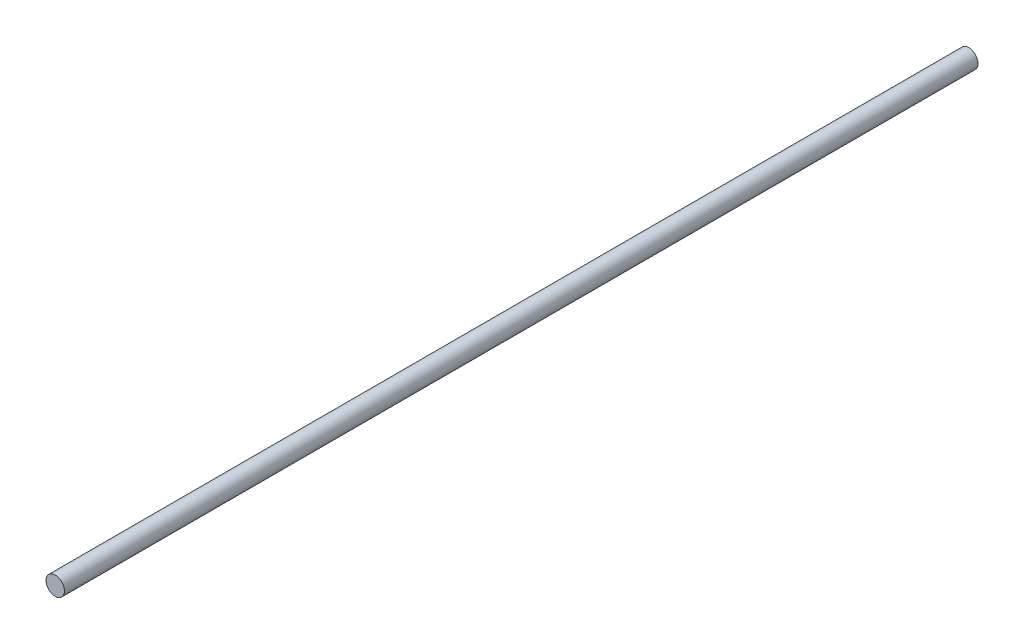
ISO-10303-21;
HEADER;
FILE_DESCRIPTION(('STEP AP214'),'2;1');
FILE_NAME('part.step','',(''),(''),'','','');
FILE_SCHEMA(('AUTOMOTIVE_DESIGN { 1 0 10303 214 1 1 1 1 }'));
ENDSEC;
DATA;
#1=APPLICATION_CONTEXT('core data for automotive mechanical design processes');
#2=APPLICATION_PROTOCOL_DEFINITION('international standard','automotive_design',2000,#1);
#3=PRODUCT_CONTEXT('',#1,'mechanical');
#4=PRODUCT('Part','Part','',(#3));
#5=PRODUCT_RELATED_PRODUCT_CATEGORY('part','',(#4));
#6=PRODUCT_DEFINITION_FORMATION('','',#4);
#7=PRODUCT_DEFINITION_CONTEXT('part definition',#1,'design');
#8=PRODUCT_DEFINITION('design','',#6,#7);
#9=PRODUCT_DEFINITION_SHAPE('','',#8);
#10=(LENGTH_UNIT() NAMED_UNIT(*) SI_UNIT(.MILLI.,.METRE.));
#11=(NAMED_UNIT(*) PLANE_ANGLE_UNIT() SI_UNIT($,.RADIAN.));
#12=(NAMED_UNIT(*) SI_UNIT($,.STERADIAN.) SOLID_ANGLE_UNIT());
#13=UNCERTAINTY_MEASURE_WITH_UNIT(LENGTH_MEASURE(1.E-05),#10,'distance_accuracy_value','');
#14=(GEOMETRIC_REPRESENTATION_CONTEXT(3) GLOBAL_UNCERTAINTY_ASSIGNED_CONTEXT((#13)) GLOBAL_UNIT_ASSIGNED_CONTEXT((#10,
#11,#12)) REPRESENTATION_CONTEXT('',''));
#15=CARTESIAN_POINT('',(0.,0.,0.));
#16=DIRECTION('',(0.,0.,1.));
#17=DIRECTION('',(1.,0.,0.));
#18=AXIS2_PLACEMENT_3D('',#15,#16,#17);
#19=CARTESIAN_POINT('',(0.,0.,495.));
#20=DIRECTION('',(0.,0.,-1.));
#21=DIRECTION('',(-1.,0.,0.));
#22=AXIS2_PLACEMENT_3D('',#19,#20,#21);
#23=CYLINDRICAL_SURFACE('',#22,5.);
#24=CARTESIAN_POINT('',(0.,0.,495.));
#25=DIRECTION('',(0.,0.,1.));
#26=DIRECTION('',(1.,0.,0.));
#27=AXIS2_PLACEMENT_3D('',#24,#25,#26);
#28=CIRCLE('',#27,5.);
#29=CARTESIAN_POINT('',(5.,0.,495.));
#30=VERTEX_POINT('',#29);
#31=EDGE_CURVE('E10',#30,#30,#28,.T.);
#32=ORIENTED_EDGE('',*,*,#31,.F.);
#33=EDGE_LOOP('',(#32));
#34=FACE_BOUND('',#33,.T.);
#35=CARTESIAN_POINT('',(0.,0.,0.));
#36=DIRECTION('',(0.,0.,1.));
#37=DIRECTION('',(1.,0.,0.));
#38=AXIS2_PLACEMENT_3D('',#35,#36,#37);
#39=CIRCLE('',#38,5.);
#40=CARTESIAN_POINT('',(5.,0.,0.));
#41=VERTEX_POINT('',#40);
#42=EDGE_CURVE('E34',#41,#41,#39,.T.);
#43=ORIENTED_EDGE('',*,*,#42,.T.);
#44=EDGE_LOOP('',(#43));
#45=FACE_BOUND('',#44,.T.);
#46=ADVANCED_FACE('F31',(#34,#45),#23,.T.);
#47=CARTESIAN_POINT('',(0.,0.,495.));
#48=DIRECTION('',(0.,0.,1.));
#49=DIRECTION('',(1.,0.,0.));
#50=AXIS2_PLACEMENT_3D('',#47,#48,#49);
#51=PLANE('',#50);
#52=ORIENTED_EDGE('',*,*,#31,.T.);
#53=EDGE_LOOP('',(#52));
#54=FACE_BOUND('',#53,.T.);
#55=ADVANCED_FACE('F46',(#54),#51,.T.);
#56=CARTESIAN_POINT('',(0.,0.,0.));
#57=DIRECTION('',(0.,0.,1.));
#58=DIRECTION('',(1.,0.,0.));
#59=AXIS2_PLACEMENT_3D('',#56,#57,#58);
#60=PLANE('',#59);
#61=ORIENTED_EDGE('',*,*,#42,.F.);
#62=EDGE_LOOP('',(#61));
#63=FACE_BOUND('',#62,.T.);
#64=ADVANCED_FACE('F44',(#63),#60,.F.);
#65=CLOSED_SHELL('',(#46,#55,#64));
#66=MANIFOLD_SOLID_BREP('B2',#65);
#67=ADVANCED_BREP_SHAPE_REPRESENTATION('',(#18,#66),#14);
#68=SHAPE_DEFINITION_REPRESENTATION(#9,#67);
ENDSEC;
END-ISO-10303-21;
